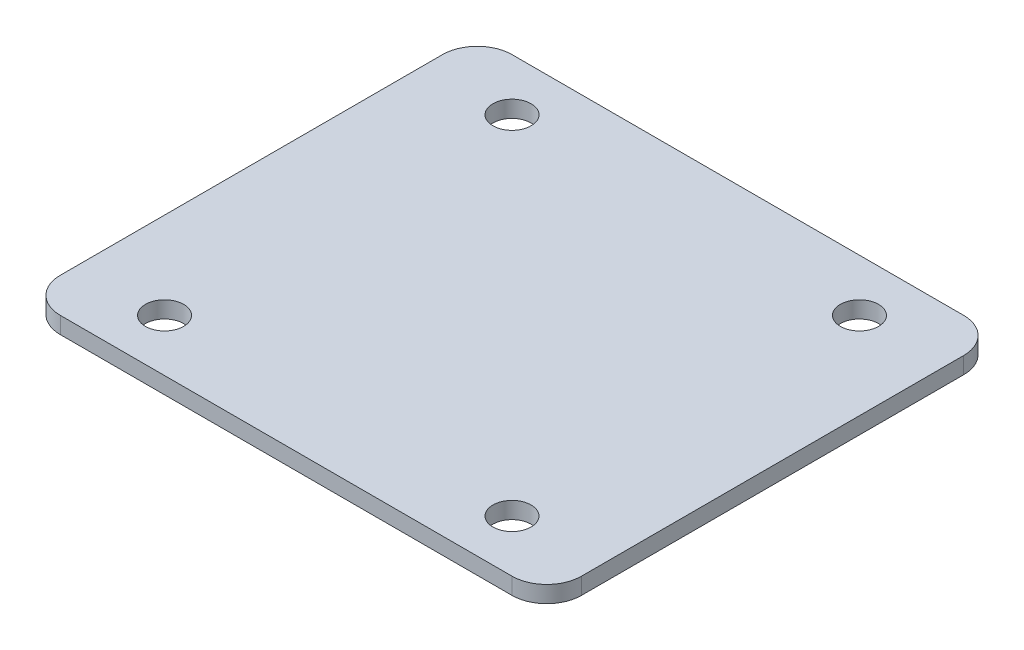
ISO-10303-21;
HEADER;
FILE_DESCRIPTION(('STEP AP214'),'2;1');
FILE_NAME('part.step','',(''),(''),'','','');
FILE_SCHEMA(('AUTOMOTIVE_DESIGN { 1 0 10303 214 1 1 1 1 }'));
ENDSEC;
DATA;
#1=APPLICATION_CONTEXT('core data for automotive mechanical design processes');
#2=APPLICATION_PROTOCOL_DEFINITION('international standard','automotive_design',2000,#1);
#3=PRODUCT_CONTEXT('',#1,'mechanical');
#4=PRODUCT('Part','Part','',(#3));
#5=PRODUCT_RELATED_PRODUCT_CATEGORY('part','',(#4));
#6=PRODUCT_DEFINITION_FORMATION('','',#4);
#7=PRODUCT_DEFINITION_CONTEXT('part definition',#1,'design');
#8=PRODUCT_DEFINITION('design','',#6,#7);
#9=PRODUCT_DEFINITION_SHAPE('','',#8);
#10=(LENGTH_UNIT() NAMED_UNIT(*) SI_UNIT(.MILLI.,.METRE.));
#11=(NAMED_UNIT(*) PLANE_ANGLE_UNIT() SI_UNIT($,.RADIAN.));
#12=(NAMED_UNIT(*) SI_UNIT($,.STERADIAN.) SOLID_ANGLE_UNIT());
#13=UNCERTAINTY_MEASURE_WITH_UNIT(LENGTH_MEASURE(1.E-05),#10,'distance_accuracy_value','');
#14=(GEOMETRIC_REPRESENTATION_CONTEXT(3) GLOBAL_UNCERTAINTY_ASSIGNED_CONTEXT((#13)) GLOBAL_UNIT_ASSIGNED_CONTEXT((#10,
#11,#12)) REPRESENTATION_CONTEXT('',''));
#15=CARTESIAN_POINT('',(0.,0.,0.));
#16=DIRECTION('',(0.,0.,1.));
#17=DIRECTION('',(1.,0.,0.));
#18=AXIS2_PLACEMENT_3D('',#15,#16,#17);
#19=CARTESIAN_POINT('',(65.,-4.8,-55.0000000000001));
#20=DIRECTION('',(0.,1.,0.));
#21=DIRECTION('',(0.,0.,1.));
#22=AXIS2_PLACEMENT_3D('',#19,#20,#21);
#23=CYLINDRICAL_SURFACE('',#22,9.99999999999999);
#24=CARTESIAN_POINT('',(65.,0.,-55.0000000000001));
#25=DIRECTION('',(0.,1.,0.));
#26=DIRECTION('',(0.,0.,-1.));
#27=AXIS2_PLACEMENT_3D('',#24,#25,#26);
#28=CIRCLE('',#27,9.99999999999999);
#29=CARTESIAN_POINT('',(75.,0.,-55.));
#30=VERTEX_POINT('',#29);
#31=CARTESIAN_POINT('',(64.9999999999999,0.,-65.0000000000001));
#32=VERTEX_POINT('',#31);
#33=EDGE_CURVE('E138',#30,#32,#28,.T.);
#34=ORIENTED_EDGE('',*,*,#33,.F.);
#35=DIRECTION('',(0.,1.,0.));
#36=VECTOR('',#35,1.);
#37=CARTESIAN_POINT('',(75.,-4.8,-55.));
#38=LINE('',#37,#36);
#39=CARTESIAN_POINT('',(75.,-4.8,-55.));
#40=VERTEX_POINT('',#39);
#41=EDGE_CURVE('E11',#40,#30,#38,.T.);
#42=ORIENTED_EDGE('',*,*,#41,.F.);
#43=CARTESIAN_POINT('',(65.,-4.8,-55.0000000000001));
#44=DIRECTION('',(0.,1.,0.));
#45=DIRECTION('',(0.,0.,-1.));
#46=AXIS2_PLACEMENT_3D('',#43,#44,#45);
#47=CIRCLE('',#46,9.99999999999999);
#48=CARTESIAN_POINT('',(64.9999999999999,-4.8,-65.0000000000001));
#49=VERTEX_POINT('',#48);
#50=EDGE_CURVE('E159',#40,#49,#47,.T.);
#51=ORIENTED_EDGE('',*,*,#50,.T.);
#52=DIRECTION('',(0.,1.,0.));
#53=VECTOR('',#52,1.);
#54=CARTESIAN_POINT('',(64.9999999999999,-4.8,-65.0000000000001));
#55=LINE('',#54,#53);
#56=EDGE_CURVE('E44',#49,#32,#55,.T.);
#57=ORIENTED_EDGE('',*,*,#56,.T.);
#58=EDGE_LOOP('',(#34,#42,#51,#57));
#59=FACE_BOUND('',#58,.T.);
#60=ADVANCED_FACE('F41',(#59),#23,.T.);
#61=CARTESIAN_POINT('',(75.,-4.8,54.9999999999999));
#62=DIRECTION('',(1.,0.,0.));
#63=DIRECTION('',(0.,0.,-1.));
#64=AXIS2_PLACEMENT_3D('',#61,#62,#63);
#65=PLANE('',#64);
#66=DIRECTION('',(0.,0.,-1.));
#67=VECTOR('',#66,1.);
#68=CARTESIAN_POINT('',(75.,0.,54.9999999999999));
#69=LINE('',#68,#67);
#70=CARTESIAN_POINT('',(75.,0.,54.9999999999999));
#71=VERTEX_POINT('',#70);
#72=EDGE_CURVE('E157',#71,#30,#69,.T.);
#73=ORIENTED_EDGE('',*,*,#72,.F.);
#74=DIRECTION('',(0.,1.,0.));
#75=VECTOR('',#74,1.);
#76=CARTESIAN_POINT('',(75.,-4.8,54.9999999999999));
#77=LINE('',#76,#75);
#78=CARTESIAN_POINT('',(75.,-4.8,54.9999999999999));
#79=VERTEX_POINT('',#78);
#80=EDGE_CURVE('E50',#79,#71,#77,.T.);
#81=ORIENTED_EDGE('',*,*,#80,.F.);
#82=DIRECTION('',(0.,0.,-1.));
#83=VECTOR('',#82,1.);
#84=CARTESIAN_POINT('',(75.,-4.8,54.9999999999999));
#85=LINE('',#84,#83);
#86=EDGE_CURVE('E128',#79,#40,#85,.T.);
#87=ORIENTED_EDGE('',*,*,#86,.T.);
#88=ORIENTED_EDGE('',*,*,#41,.T.);
#89=EDGE_LOOP('',(#73,#81,#87,#88));
#90=FACE_BOUND('',#89,.T.);
#91=ADVANCED_FACE('F171',(#90),#65,.T.);
#92=CARTESIAN_POINT('',(65.,-4.8,55.));
#93=DIRECTION('',(0.,1.,0.));
#94=DIRECTION('',(0.,0.,1.));
#95=AXIS2_PLACEMENT_3D('',#92,#93,#94);
#96=CYLINDRICAL_SURFACE('',#95,9.99999999999999);
#97=CARTESIAN_POINT('',(65.,0.,55.));
#98=DIRECTION('',(0.,1.,0.));
#99=DIRECTION('',(0.,0.,-1.));
#100=AXIS2_PLACEMENT_3D('',#97,#98,#99);
#101=CIRCLE('',#100,9.99999999999999);
#102=CARTESIAN_POINT('',(65.,0.,64.9999999999999));
#103=VERTEX_POINT('',#102);
#104=EDGE_CURVE('E115',#103,#71,#101,.T.);
#105=ORIENTED_EDGE('',*,*,#104,.F.);
#106=DIRECTION('',(0.,1.,0.));
#107=VECTOR('',#106,1.);
#108=CARTESIAN_POINT('',(65.,-4.8,64.9999999999999));
#109=LINE('',#108,#107);
#110=CARTESIAN_POINT('',(65.,-4.8,64.9999999999999));
#111=VERTEX_POINT('',#110);
#112=EDGE_CURVE('E110',#111,#103,#109,.T.);
#113=ORIENTED_EDGE('',*,*,#112,.F.);
#114=CARTESIAN_POINT('',(65.,-4.8,55.));
#115=DIRECTION('',(0.,1.,0.));
#116=DIRECTION('',(0.,0.,-1.));
#117=AXIS2_PLACEMENT_3D('',#114,#115,#116);
#118=CIRCLE('',#117,9.99999999999999);
#119=EDGE_CURVE('E113',#111,#79,#118,.T.);
#120=ORIENTED_EDGE('',*,*,#119,.T.);
#121=ORIENTED_EDGE('',*,*,#80,.T.);
#122=EDGE_LOOP('',(#105,#113,#120,#121));
#123=FACE_BOUND('',#122,.T.);
#124=ADVANCED_FACE('F112',(#123),#96,.T.);
#125=CARTESIAN_POINT('',(-64.9999999999999,-4.8,65.));
#126=DIRECTION('',(0.,0.,1.));
#127=DIRECTION('',(1.,0.,0.));
#128=AXIS2_PLACEMENT_3D('',#125,#126,#127);
#129=PLANE('',#128);
#130=DIRECTION('',(1.,0.,0.));
#131=VECTOR('',#130,1.);
#132=CARTESIAN_POINT('',(-64.9999999999999,0.,65.));
#133=LINE('',#132,#131);
#134=CARTESIAN_POINT('',(-64.9999999999999,0.,65.));
#135=VERTEX_POINT('',#134);
#136=EDGE_CURVE('E154',#135,#103,#133,.T.);
#137=ORIENTED_EDGE('',*,*,#136,.F.);
#138=DIRECTION('',(0.,1.,0.));
#139=VECTOR('',#138,1.);
#140=CARTESIAN_POINT('',(-64.9999999999999,-4.8,65.));
#141=LINE('',#140,#139);
#142=CARTESIAN_POINT('',(-64.9999999999999,-4.8,65.));
#143=VERTEX_POINT('',#142);
#144=EDGE_CURVE('E120',#143,#135,#141,.T.);
#145=ORIENTED_EDGE('',*,*,#144,.F.);
#146=DIRECTION('',(1.,0.,0.));
#147=VECTOR('',#146,1.);
#148=CARTESIAN_POINT('',(-64.9999999999999,-4.8,65.));
#149=LINE('',#148,#147);
#150=EDGE_CURVE('E126',#143,#111,#149,.T.);
#151=ORIENTED_EDGE('',*,*,#150,.T.);
#152=ORIENTED_EDGE('',*,*,#112,.T.);
#153=EDGE_LOOP('',(#137,#145,#151,#152));
#154=FACE_BOUND('',#153,.T.);
#155=ADVANCED_FACE('F130',(#154),#129,.T.);
#156=CARTESIAN_POINT('',(-65.,-4.8,55.));
#157=DIRECTION('',(0.,1.,0.));
#158=DIRECTION('',(0.,0.,1.));
#159=AXIS2_PLACEMENT_3D('',#156,#157,#158);
#160=CYLINDRICAL_SURFACE('',#159,10.);
#161=CARTESIAN_POINT('',(-65.,0.,55.));
#162=DIRECTION('',(0.,1.,0.));
#163=DIRECTION('',(0.,0.,-1.));
#164=AXIS2_PLACEMENT_3D('',#161,#162,#163);
#165=CIRCLE('',#164,10.);
#166=CARTESIAN_POINT('',(-75.,0.,54.9999999999999));
#167=VERTEX_POINT('',#166);
#168=EDGE_CURVE('E151',#167,#135,#165,.T.);
#169=ORIENTED_EDGE('',*,*,#168,.F.);
#170=DIRECTION('',(0.,1.,0.));
#171=VECTOR('',#170,1.);
#172=CARTESIAN_POINT('',(-75.,-4.8,54.9999999999999));
#173=LINE('',#172,#171);
#174=CARTESIAN_POINT('',(-75.,-4.8,54.9999999999999));
#175=VERTEX_POINT('',#174);
#176=EDGE_CURVE('E163',#175,#167,#173,.T.);
#177=ORIENTED_EDGE('',*,*,#176,.F.);
#178=CARTESIAN_POINT('',(-65.,-4.8,55.));
#179=DIRECTION('',(0.,1.,0.));
#180=DIRECTION('',(0.,0.,-1.));
#181=AXIS2_PLACEMENT_3D('',#178,#179,#180);
#182=CIRCLE('',#181,10.);
#183=EDGE_CURVE('E131',#175,#143,#182,.T.);
#184=ORIENTED_EDGE('',*,*,#183,.T.);
#185=ORIENTED_EDGE('',*,*,#144,.T.);
#186=EDGE_LOOP('',(#169,#177,#184,#185));
#187=FACE_BOUND('',#186,.T.);
#188=ADVANCED_FACE('F184',(#187),#160,.T.);
#189=CARTESIAN_POINT('',(-75.,-4.8,54.9999999999999));
#190=DIRECTION('',(-1.,0.,0.));
#191=DIRECTION('',(0.,0.,1.));
#192=AXIS2_PLACEMENT_3D('',#189,#190,#191);
#193=PLANE('',#192);
#194=DIRECTION('',(0.,0.,1.));
#195=VECTOR('',#194,1.);
#196=CARTESIAN_POINT('',(-75.,0.,54.9999999999999));
#197=LINE('',#196,#195);
#198=CARTESIAN_POINT('',(-75.,0.,-55.));
#199=VERTEX_POINT('',#198);
#200=EDGE_CURVE('E148',#199,#167,#197,.T.);
#201=ORIENTED_EDGE('',*,*,#200,.F.);
#202=DIRECTION('',(0.,1.,0.));
#203=VECTOR('',#202,1.);
#204=CARTESIAN_POINT('',(-75.,-4.8,-55.));
#205=LINE('',#204,#203);
#206=CARTESIAN_POINT('',(-75.,-4.8,-55.));
#207=VERTEX_POINT('',#206);
#208=EDGE_CURVE('E165',#207,#199,#205,.T.);
#209=ORIENTED_EDGE('',*,*,#208,.F.);
#210=DIRECTION('',(0.,0.,1.));
#211=VECTOR('',#210,1.);
#212=CARTESIAN_POINT('',(-75.,-4.8,54.9999999999999));
#213=LINE('',#212,#211);
#214=EDGE_CURVE('E133',#207,#175,#213,.T.);
#215=ORIENTED_EDGE('',*,*,#214,.T.);
#216=ORIENTED_EDGE('',*,*,#176,.T.);
#217=EDGE_LOOP('',(#201,#209,#215,#216));
#218=FACE_BOUND('',#217,.T.);
#219=ADVANCED_FACE('F187',(#218),#193,.T.);
#220=CARTESIAN_POINT('',(-65.,-4.8,-55.0000000000001));
#221=DIRECTION('',(0.,1.,0.));
#222=DIRECTION('',(0.,0.,1.));
#223=AXIS2_PLACEMENT_3D('',#220,#221,#222);
#224=CYLINDRICAL_SURFACE('',#223,9.99999999999999);
#225=CARTESIAN_POINT('',(-65.,0.,-55.0000000000001));
#226=DIRECTION('',(0.,1.,0.));
#227=DIRECTION('',(0.,0.,-1.));
#228=AXIS2_PLACEMENT_3D('',#225,#226,#227);
#229=CIRCLE('',#228,9.99999999999999);
#230=CARTESIAN_POINT('',(-64.9999999999999,0.,-65.0000000000001));
#231=VERTEX_POINT('',#230);
#232=EDGE_CURVE('E145',#231,#199,#229,.T.);
#233=ORIENTED_EDGE('',*,*,#232,.F.);
#234=DIRECTION('',(0.,1.,0.));
#235=VECTOR('',#234,1.);
#236=CARTESIAN_POINT('',(-64.9999999999999,-4.8,-65.0000000000001));
#237=LINE('',#236,#235);
#238=CARTESIAN_POINT('',(-64.9999999999999,-4.8,-65.0000000000001));
#239=VERTEX_POINT('',#238);
#240=EDGE_CURVE('E166',#239,#231,#237,.T.);
#241=ORIENTED_EDGE('',*,*,#240,.F.);
#242=CARTESIAN_POINT('',(-65.,-4.8,-55.0000000000001));
#243=DIRECTION('',(0.,1.,0.));
#244=DIRECTION('',(0.,0.,-1.));
#245=AXIS2_PLACEMENT_3D('',#242,#243,#244);
#246=CIRCLE('',#245,9.99999999999999);
#247=EDGE_CURVE('E253',#239,#207,#246,.T.);
#248=ORIENTED_EDGE('',*,*,#247,.T.);
#249=ORIENTED_EDGE('',*,*,#208,.T.);
#250=EDGE_LOOP('',(#233,#241,#248,#249));
#251=FACE_BOUND('',#250,.T.);
#252=ADVANCED_FACE('F191',(#251),#224,.T.);
#253=CARTESIAN_POINT('',(-64.9999999999999,-4.8,-65.0000000000001));
#254=DIRECTION('',(0.,0.,-1.));
#255=DIRECTION('',(-1.,0.,0.));
#256=AXIS2_PLACEMENT_3D('',#253,#254,#255);
#257=PLANE('',#256);
#258=DIRECTION('',(-1.,0.,0.));
#259=VECTOR('',#258,1.);
#260=CARTESIAN_POINT('',(-64.9999999999999,0.,-65.0000000000001));
#261=LINE('',#260,#259);
#262=EDGE_CURVE('E141',#32,#231,#261,.T.);
#263=ORIENTED_EDGE('',*,*,#262,.F.);
#264=ORIENTED_EDGE('',*,*,#56,.F.);
#265=DIRECTION('',(-1.,0.,0.));
#266=VECTOR('',#265,1.);
#267=CARTESIAN_POINT('',(-64.9999999999999,-4.8,-65.0000000000001));
#268=LINE('',#267,#266);
#269=EDGE_CURVE('E251',#49,#239,#268,.T.);
#270=ORIENTED_EDGE('',*,*,#269,.T.);
#271=ORIENTED_EDGE('',*,*,#240,.T.);
#272=EDGE_LOOP('',(#263,#264,#270,#271));
#273=FACE_BOUND('',#272,.T.);
#274=ADVANCED_FACE('F168',(#273),#257,.T.);
#275=CARTESIAN_POINT('',(65.,-4.8,-55.0000000000001));
#276=DIRECTION('',(0.,-1.,0.));
#277=DIRECTION('',(0.,0.,-1.));
#278=AXIS2_PLACEMENT_3D('',#275,#276,#277);
#279=PLANE('',#278);
#280=CARTESIAN_POINT('',(-50.,-4.8,50.));
#281=DIRECTION('',(0.,1.,0.));
#282=DIRECTION('',(0.,0.,1.));
#283=AXIS2_PLACEMENT_3D('',#280,#281,#282);
#284=CIRCLE('',#283,5.5);
#285=CARTESIAN_POINT('',(-50.,-4.8,55.5));
#286=VERTEX_POINT('',#285);
#287=EDGE_CURVE('E226',#286,#286,#284,.T.);
#288=ORIENTED_EDGE('',*,*,#287,.T.);
#289=EDGE_LOOP('',(#288));
#290=FACE_BOUND('',#289,.T.);
#291=CARTESIAN_POINT('',(50.,-4.8,50.));
#292=DIRECTION('',(0.,1.,0.));
#293=DIRECTION('',(0.,0.,1.));
#294=AXIS2_PLACEMENT_3D('',#291,#292,#293);
#295=CIRCLE('',#294,5.5);
#296=CARTESIAN_POINT('',(50.,-4.8,55.5));
#297=VERTEX_POINT('',#296);
#298=EDGE_CURVE('E234',#297,#297,#295,.T.);
#299=ORIENTED_EDGE('',*,*,#298,.T.);
#300=EDGE_LOOP('',(#299));
#301=FACE_BOUND('',#300,.T.);
#302=CARTESIAN_POINT('',(50.,-4.8,-50.));
#303=DIRECTION('',(0.,1.,0.));
#304=DIRECTION('',(0.,0.,1.));
#305=AXIS2_PLACEMENT_3D('',#302,#303,#304);
#306=CIRCLE('',#305,5.5);
#307=CARTESIAN_POINT('',(50.,-4.8,-44.5));
#308=VERTEX_POINT('',#307);
#309=EDGE_CURVE('E240',#308,#308,#306,.T.);
#310=ORIENTED_EDGE('',*,*,#309,.T.);
#311=EDGE_LOOP('',(#310));
#312=FACE_BOUND('',#311,.T.);
#313=CARTESIAN_POINT('',(-50.,-4.8,-50.));
#314=DIRECTION('',(0.,1.,0.));
#315=DIRECTION('',(0.,0.,1.));
#316=AXIS2_PLACEMENT_3D('',#313,#314,#315);
#317=CIRCLE('',#316,5.5);
#318=CARTESIAN_POINT('',(-50.,-4.8,-44.5));
#319=VERTEX_POINT('',#318);
#320=EDGE_CURVE('E142',#319,#319,#317,.T.);
#321=ORIENTED_EDGE('',*,*,#320,.T.);
#322=EDGE_LOOP('',(#321));
#323=FACE_BOUND('',#322,.T.);
#324=ORIENTED_EDGE('',*,*,#50,.F.);
#325=ORIENTED_EDGE('',*,*,#86,.F.);
#326=ORIENTED_EDGE('',*,*,#119,.F.);
#327=ORIENTED_EDGE('',*,*,#150,.F.);
#328=ORIENTED_EDGE('',*,*,#183,.F.);
#329=ORIENTED_EDGE('',*,*,#214,.F.);
#330=ORIENTED_EDGE('',*,*,#247,.F.);
#331=ORIENTED_EDGE('',*,*,#269,.F.);
#332=EDGE_LOOP('',(#324,#325,#326,#327,#328,#329,#330,#331));
#333=FACE_BOUND('',#332,.T.);
#334=ADVANCED_FACE('F124',(#290,#301,#312,#323,#333),#279,.T.);
#335=CARTESIAN_POINT('',(65.,0.,-55.0000000000001));
#336=DIRECTION('',(0.,-1.,0.));
#337=DIRECTION('',(0.,0.,-1.));
#338=AXIS2_PLACEMENT_3D('',#335,#336,#337);
#339=PLANE('',#338);
#340=CARTESIAN_POINT('',(-50.,0.,50.));
#341=DIRECTION('',(0.,1.,0.));
#342=DIRECTION('',(0.,0.,1.));
#343=AXIS2_PLACEMENT_3D('',#340,#341,#342);
#344=CIRCLE('',#343,5.5);
#345=CARTESIAN_POINT('',(-50.,0.,55.5));
#346=VERTEX_POINT('',#345);
#347=EDGE_CURVE('E229',#346,#346,#344,.T.);
#348=ORIENTED_EDGE('',*,*,#347,.F.);
#349=EDGE_LOOP('',(#348));
#350=FACE_BOUND('',#349,.T.);
#351=CARTESIAN_POINT('',(50.,0.,50.));
#352=DIRECTION('',(0.,1.,0.));
#353=DIRECTION('',(0.,0.,1.));
#354=AXIS2_PLACEMENT_3D('',#351,#352,#353);
#355=CIRCLE('',#354,5.5);
#356=CARTESIAN_POINT('',(50.,0.,55.5));
#357=VERTEX_POINT('',#356);
#358=EDGE_CURVE('E231',#357,#357,#355,.T.);
#359=ORIENTED_EDGE('',*,*,#358,.F.);
#360=EDGE_LOOP('',(#359));
#361=FACE_BOUND('',#360,.T.);
#362=CARTESIAN_POINT('',(50.,0.,-50.));
#363=DIRECTION('',(0.,1.,0.));
#364=DIRECTION('',(0.,0.,1.));
#365=AXIS2_PLACEMENT_3D('',#362,#363,#364);
#366=CIRCLE('',#365,5.5);
#367=CARTESIAN_POINT('',(50.,0.,-44.5));
#368=VERTEX_POINT('',#367);
#369=EDGE_CURVE('E237',#368,#368,#366,.T.);
#370=ORIENTED_EDGE('',*,*,#369,.F.);
#371=EDGE_LOOP('',(#370));
#372=FACE_BOUND('',#371,.T.);
#373=CARTESIAN_POINT('',(-50.,0.,-50.));
#374=DIRECTION('',(0.,1.,0.));
#375=DIRECTION('',(0.,0.,1.));
#376=AXIS2_PLACEMENT_3D('',#373,#374,#375);
#377=CIRCLE('',#376,5.5);
#378=CARTESIAN_POINT('',(-50.,0.,-44.5));
#379=VERTEX_POINT('',#378);
#380=EDGE_CURVE('E243',#379,#379,#377,.T.);
#381=ORIENTED_EDGE('',*,*,#380,.F.);
#382=EDGE_LOOP('',(#381));
#383=FACE_BOUND('',#382,.T.);
#384=ORIENTED_EDGE('',*,*,#33,.T.);
#385=ORIENTED_EDGE('',*,*,#262,.T.);
#386=ORIENTED_EDGE('',*,*,#232,.T.);
#387=ORIENTED_EDGE('',*,*,#200,.T.);
#388=ORIENTED_EDGE('',*,*,#168,.T.);
#389=ORIENTED_EDGE('',*,*,#136,.T.);
#390=ORIENTED_EDGE('',*,*,#104,.T.);
#391=ORIENTED_EDGE('',*,*,#72,.T.);
#392=EDGE_LOOP('',(#384,#385,#386,#387,#388,#389,#390,#391));
#393=FACE_BOUND('',#392,.T.);
#394=ADVANCED_FACE('F170',(#350,#361,#372,#383,#393),#339,.F.);
#395=CARTESIAN_POINT('',(-50.,-4.8,-50.));
#396=DIRECTION('',(0.,1.,0.));
#397=DIRECTION('',(0.,0.,1.));
#398=AXIS2_PLACEMENT_3D('',#395,#396,#397);
#399=CYLINDRICAL_SURFACE('',#398,5.5);
#400=ORIENTED_EDGE('',*,*,#320,.F.);
#401=EDGE_LOOP('',(#400));
#402=FACE_BOUND('',#401,.T.);
#403=ORIENTED_EDGE('',*,*,#380,.T.);
#404=EDGE_LOOP('',(#403));
#405=FACE_BOUND('',#404,.T.);
#406=ADVANCED_FACE('F203',(#402,#405),#399,.F.);
#407=CARTESIAN_POINT('',(50.,-4.8,-50.));
#408=DIRECTION('',(0.,1.,0.));
#409=DIRECTION('',(0.,0.,1.));
#410=AXIS2_PLACEMENT_3D('',#407,#408,#409);
#411=CYLINDRICAL_SURFACE('',#410,5.5);
#412=ORIENTED_EDGE('',*,*,#309,.F.);
#413=EDGE_LOOP('',(#412));
#414=FACE_BOUND('',#413,.T.);
#415=ORIENTED_EDGE('',*,*,#369,.T.);
#416=EDGE_LOOP('',(#415));
#417=FACE_BOUND('',#416,.T.);
#418=ADVANCED_FACE('F210',(#414,#417),#411,.F.);
#419=CARTESIAN_POINT('',(50.,-4.8,50.));
#420=DIRECTION('',(0.,1.,0.));
#421=DIRECTION('',(0.,0.,1.));
#422=AXIS2_PLACEMENT_3D('',#419,#420,#421);
#423=CYLINDRICAL_SURFACE('',#422,5.5);
#424=ORIENTED_EDGE('',*,*,#298,.F.);
#425=EDGE_LOOP('',(#424));
#426=FACE_BOUND('',#425,.T.);
#427=ORIENTED_EDGE('',*,*,#358,.T.);
#428=EDGE_LOOP('',(#427));
#429=FACE_BOUND('',#428,.T.);
#430=ADVANCED_FACE('F214',(#426,#429),#423,.F.);
#431=CARTESIAN_POINT('',(-50.,-4.8,50.));
#432=DIRECTION('',(0.,1.,0.));
#433=DIRECTION('',(0.,0.,1.));
#434=AXIS2_PLACEMENT_3D('',#431,#432,#433);
#435=CYLINDRICAL_SURFACE('',#434,5.5);
#436=ORIENTED_EDGE('',*,*,#287,.F.);
#437=EDGE_LOOP('',(#436));
#438=FACE_BOUND('',#437,.T.);
#439=ORIENTED_EDGE('',*,*,#347,.T.);
#440=EDGE_LOOP('',(#439));
#441=FACE_BOUND('',#440,.T.);
#442=ADVANCED_FACE('F218',(#438,#441),#435,.F.);
#443=CLOSED_SHELL('',(#60,#91,#124,#155,#188,#219,#252,#274,#334,#394,#406,#418,#430,#442));
#444=MANIFOLD_SOLID_BREP('B2',#443);
#445=ADVANCED_BREP_SHAPE_REPRESENTATION('',(#18,#444),#14);
#446=SHAPE_DEFINITION_REPRESENTATION(#9,#445);
ENDSEC;
END-ISO-10303-21;
